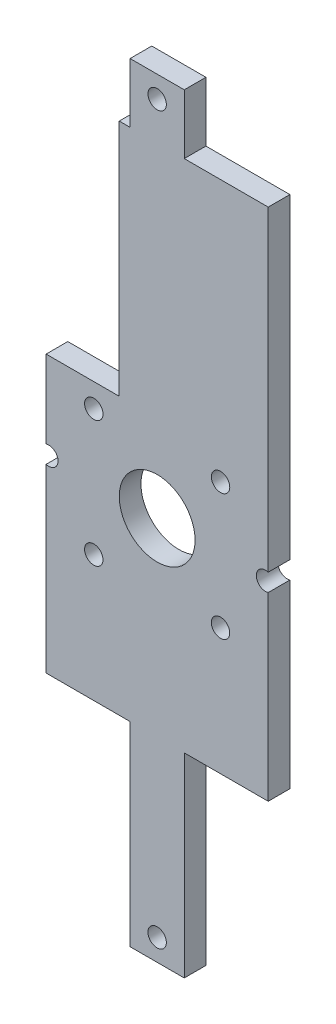
ISO-10303-21;
HEADER;
FILE_DESCRIPTION(('STEP AP214'),'2;1');
FILE_NAME('part.step','',(''),(''),'','','');
FILE_SCHEMA(('AUTOMOTIVE_DESIGN { 1 0 10303 214 1 1 1 1 }'));
ENDSEC;
DATA;
#1=APPLICATION_CONTEXT('core data for automotive mechanical design processes');
#2=APPLICATION_PROTOCOL_DEFINITION('international standard','automotive_design',2000,#1);
#3=PRODUCT_CONTEXT('',#1,'mechanical');
#4=PRODUCT('Part','Part','',(#3));
#5=PRODUCT_RELATED_PRODUCT_CATEGORY('part','',(#4));
#6=PRODUCT_DEFINITION_FORMATION('','',#4);
#7=PRODUCT_DEFINITION_CONTEXT('part definition',#1,'design');
#8=PRODUCT_DEFINITION('design','',#6,#7);
#9=PRODUCT_DEFINITION_SHAPE('','',#8);
#10=(LENGTH_UNIT() NAMED_UNIT(*) SI_UNIT(.MILLI.,.METRE.));
#11=(NAMED_UNIT(*) PLANE_ANGLE_UNIT() SI_UNIT($,.RADIAN.));
#12=(NAMED_UNIT(*) SI_UNIT($,.STERADIAN.) SOLID_ANGLE_UNIT());
#13=UNCERTAINTY_MEASURE_WITH_UNIT(LENGTH_MEASURE(1.E-05),#10,'distance_accuracy_value','');
#14=(GEOMETRIC_REPRESENTATION_CONTEXT(3) GLOBAL_UNCERTAINTY_ASSIGNED_CONTEXT((#13)) GLOBAL_UNIT_ASSIGNED_CONTEXT((#10,
#11,#12)) REPRESENTATION_CONTEXT('',''));
#15=CARTESIAN_POINT('',(0.,0.,0.));
#16=DIRECTION('',(0.,0.,1.));
#17=DIRECTION('',(1.,0.,0.));
#18=AXIS2_PLACEMENT_3D('',#15,#16,#17);
#19=CARTESIAN_POINT('',(-20.5,-35.,4.));
#20=DIRECTION('',(0.,0.,1.));
#21=DIRECTION('',(1.,0.,0.));
#22=AXIS2_PLACEMENT_3D('',#19,#20,#21);
#23=PLANE('',#22);
#24=CARTESIAN_POINT('',(11.7,11.65,4.));
#25=DIRECTION('',(0.,0.,1.));
#26=DIRECTION('',(1.,0.,0.));
#27=AXIS2_PLACEMENT_3D('',#24,#25,#26);
#28=CIRCLE('',#27,1.7);
#29=CARTESIAN_POINT('',(13.4,11.65,4.));
#30=VERTEX_POINT('',#29);
#31=EDGE_CURVE('E229',#30,#30,#28,.T.);
#32=ORIENTED_EDGE('',*,*,#31,.F.);
#33=EDGE_LOOP('',(#32));
#34=FACE_BOUND('',#33,.T.);
#35=CARTESIAN_POINT('',(0.,67.,4.));
#36=DIRECTION('',(0.,0.,1.));
#37=DIRECTION('',(1.,0.,0.));
#38=AXIS2_PLACEMENT_3D('',#35,#36,#37);
#39=CIRCLE('',#38,1.7);
#40=CARTESIAN_POINT('',(1.7,67.,4.));
#41=VERTEX_POINT('',#40);
#42=EDGE_CURVE('E206',#41,#41,#39,.T.);
#43=ORIENTED_EDGE('',*,*,#42,.F.);
#44=EDGE_LOOP('',(#43));
#45=FACE_BOUND('',#44,.T.);
#46=CARTESIAN_POINT('',(0.,0.,4.));
#47=DIRECTION('',(0.,0.,1.));
#48=DIRECTION('',(1.,0.,0.));
#49=AXIS2_PLACEMENT_3D('',#46,#47,#48);
#50=CIRCLE('',#49,7.);
#51=CARTESIAN_POINT('',(7.,0.,4.));
#52=VERTEX_POINT('',#51);
#53=EDGE_CURVE('E201',#52,#52,#50,.T.);
#54=ORIENTED_EDGE('',*,*,#53,.F.);
#55=EDGE_LOOP('',(#54));
#56=FACE_BOUND('',#55,.T.);
#57=CARTESIAN_POINT('',(-11.7,11.65,4.));
#58=DIRECTION('',(0.,0.,1.));
#59=DIRECTION('',(1.,0.,0.));
#60=AXIS2_PLACEMENT_3D('',#57,#58,#59);
#61=CIRCLE('',#60,1.7);
#62=CARTESIAN_POINT('',(-10.,11.65,4.));
#63=VERTEX_POINT('',#62);
#64=EDGE_CURVE('E205',#63,#63,#61,.T.);
#65=ORIENTED_EDGE('',*,*,#64,.F.);
#66=EDGE_LOOP('',(#65));
#67=FACE_BOUND('',#66,.T.);
#68=CARTESIAN_POINT('',(11.7,-11.65,4.));
#69=DIRECTION('',(0.,0.,1.));
#70=DIRECTION('',(1.,0.,0.));
#71=AXIS2_PLACEMENT_3D('',#68,#69,#70);
#72=CIRCLE('',#71,1.7);
#73=CARTESIAN_POINT('',(13.4,-11.65,4.));
#74=VERTEX_POINT('',#73);
#75=EDGE_CURVE('E210',#74,#74,#72,.T.);
#76=ORIENTED_EDGE('',*,*,#75,.F.);
#77=EDGE_LOOP('',(#76));
#78=FACE_BOUND('',#77,.T.);
#79=CARTESIAN_POINT('',(-11.7,-11.65,4.));
#80=DIRECTION('',(0.,0.,1.));
#81=DIRECTION('',(1.,0.,0.));
#82=AXIS2_PLACEMENT_3D('',#79,#80,#81);
#83=CIRCLE('',#82,1.7);
#84=CARTESIAN_POINT('',(-10.,-11.65,4.));
#85=VERTEX_POINT('',#84);
#86=EDGE_CURVE('E207',#85,#85,#83,.T.);
#87=ORIENTED_EDGE('',*,*,#86,.F.);
#88=EDGE_LOOP('',(#87));
#89=FACE_BOUND('',#88,.T.);
#90=CARTESIAN_POINT('',(0.,-67.,4.));
#91=DIRECTION('',(0.,0.,1.));
#92=DIRECTION('',(1.,0.,0.));
#93=AXIS2_PLACEMENT_3D('',#90,#91,#92);
#94=CIRCLE('',#93,1.7);
#95=CARTESIAN_POINT('',(1.7,-67.,4.));
#96=VERTEX_POINT('',#95);
#97=EDGE_CURVE('E26',#96,#96,#94,.T.);
#98=ORIENTED_EDGE('',*,*,#97,.F.);
#99=EDGE_LOOP('',(#98));
#100=FACE_BOUND('',#99,.T.);
#101=DIRECTION('',(0.,1.,0.));
#102=VECTOR('',#101,1.);
#103=CARTESIAN_POINT('',(-20.5,-35.,4.));
#104=LINE('',#103,#102);
#105=CARTESIAN_POINT('',(-20.5,-35.,4.));
#106=VERTEX_POINT('',#105);
#107=CARTESIAN_POINT('',(-20.5,-1.624807680927,4.));
#108=VERTEX_POINT('',#107);
#109=EDGE_CURVE('E384',#106,#108,#104,.T.);
#110=ORIENTED_EDGE('',*,*,#109,.F.);
#111=DIRECTION('',(1.,0.,0.));
#112=VECTOR('',#111,1.);
#113=CARTESIAN_POINT('',(-20.5,-35.,4.));
#114=LINE('',#113,#112);
#115=CARTESIAN_POINT('',(-5.,-35.,4.));
#116=VERTEX_POINT('',#115);
#117=EDGE_CURVE('E401',#106,#116,#114,.T.);
#118=ORIENTED_EDGE('',*,*,#117,.T.);
#119=DIRECTION('',(0.,1.,0.));
#120=VECTOR('',#119,1.);
#121=CARTESIAN_POINT('',(-5.,-71.,4.));
#122=LINE('',#121,#120);
#123=CARTESIAN_POINT('',(-5.,-71.,4.));
#124=VERTEX_POINT('',#123);
#125=EDGE_CURVE('E400',#124,#116,#122,.T.);
#126=ORIENTED_EDGE('',*,*,#125,.F.);
#127=DIRECTION('',(1.,0.,0.));
#128=VECTOR('',#127,1.);
#129=CARTESIAN_POINT('',(-5.,-71.,4.));
#130=LINE('',#129,#128);
#131=CARTESIAN_POINT('',(5.,-71.,4.));
#132=VERTEX_POINT('',#131);
#133=EDGE_CURVE('E393',#124,#132,#130,.T.);
#134=ORIENTED_EDGE('',*,*,#133,.T.);
#135=DIRECTION('',(0.,1.,0.));
#136=VECTOR('',#135,1.);
#137=CARTESIAN_POINT('',(5.,-71.,4.));
#138=LINE('',#137,#136);
#139=CARTESIAN_POINT('',(5.,-35.,4.));
#140=VERTEX_POINT('',#139);
#141=EDGE_CURVE('E435',#132,#140,#138,.T.);
#142=ORIENTED_EDGE('',*,*,#141,.T.);
#143=DIRECTION('',(1.,0.,0.));
#144=VECTOR('',#143,1.);
#145=CARTESIAN_POINT('',(-20.5,-35.,4.));
#146=LINE('',#145,#144);
#147=CARTESIAN_POINT('',(20.5,-35.,4.));
#148=VERTEX_POINT('',#147);
#149=EDGE_CURVE('E445',#140,#148,#146,.T.);
#150=ORIENTED_EDGE('',*,*,#149,.T.);
#151=DIRECTION('',(0.,1.,0.));
#152=VECTOR('',#151,1.);
#153=CARTESIAN_POINT('',(20.5,-35.,4.));
#154=LINE('',#153,#152);
#155=CARTESIAN_POINT('',(20.5,-1.624807680927,4.));
#156=VERTEX_POINT('',#155);
#157=EDGE_CURVE('E261',#148,#156,#154,.T.);
#158=ORIENTED_EDGE('',*,*,#157,.T.);
#159=CARTESIAN_POINT('',(20.,0.,4.));
#160=DIRECTION('',(0.,0.,1.));
#161=DIRECTION('',(1.,0.,0.));
#162=AXIS2_PLACEMENT_3D('',#159,#160,#161);
#163=CIRCLE('',#162,1.7);
#164=CARTESIAN_POINT('',(20.5,1.624807680927,4.));
#165=VERTEX_POINT('',#164);
#166=EDGE_CURVE('E278',#165,#156,#163,.T.);
#167=ORIENTED_EDGE('',*,*,#166,.F.);
#168=DIRECTION('',(0.,1.,0.));
#169=VECTOR('',#168,1.);
#170=CARTESIAN_POINT('',(20.5,-35.,4.));
#171=LINE('',#170,#169);
#172=CARTESIAN_POINT('',(20.5,60.,4.));
#173=VERTEX_POINT('',#172);
#174=EDGE_CURVE('E285',#165,#173,#171,.T.);
#175=ORIENTED_EDGE('',*,*,#174,.T.);
#176=DIRECTION('',(1.,0.,0.));
#177=VECTOR('',#176,1.);
#178=CARTESIAN_POINT('',(-20.5,60.,4.));
#179=LINE('',#178,#177);
#180=CARTESIAN_POINT('',(5.,60.,4.));
#181=VERTEX_POINT('',#180);
#182=EDGE_CURVE('E298',#181,#173,#179,.T.);
#183=ORIENTED_EDGE('',*,*,#182,.F.);
#184=DIRECTION('',(0.,1.,0.));
#185=VECTOR('',#184,1.);
#186=CARTESIAN_POINT('',(5.,60.,4.));
#187=LINE('',#186,#185);
#188=CARTESIAN_POINT('',(5.,71.,4.));
#189=VERTEX_POINT('',#188);
#190=EDGE_CURVE('E311',#181,#189,#187,.T.);
#191=ORIENTED_EDGE('',*,*,#190,.T.);
#192=DIRECTION('',(1.,0.,0.));
#193=VECTOR('',#192,1.);
#194=CARTESIAN_POINT('',(-5.,71.,4.));
#195=LINE('',#194,#193);
#196=CARTESIAN_POINT('',(-5.,71.,4.));
#197=VERTEX_POINT('',#196);
#198=EDGE_CURVE('E322',#197,#189,#195,.T.);
#199=ORIENTED_EDGE('',*,*,#198,.F.);
#200=DIRECTION('',(0.,1.,0.));
#201=VECTOR('',#200,1.);
#202=CARTESIAN_POINT('',(-5.,60.,4.));
#203=LINE('',#202,#201);
#204=CARTESIAN_POINT('',(-5.,60.,4.));
#205=VERTEX_POINT('',#204);
#206=EDGE_CURVE('E325',#205,#197,#203,.T.);
#207=ORIENTED_EDGE('',*,*,#206,.F.);
#208=DIRECTION('',(1.,0.,0.));
#209=VECTOR('',#208,1.);
#210=CARTESIAN_POINT('',(-20.5,60.,4.));
#211=LINE('',#210,#209);
#212=CARTESIAN_POINT('',(-7.,60.,4.));
#213=VERTEX_POINT('',#212);
#214=EDGE_CURVE('E340',#213,#205,#211,.T.);
#215=ORIENTED_EDGE('',*,*,#214,.F.);
#216=DIRECTION('',(0.,1.,0.));
#217=VECTOR('',#216,1.);
#218=CARTESIAN_POINT('',(-7.,-9.5,4.));
#219=LINE('',#218,#217);
#220=CARTESIAN_POINT('',(-7.,16.,4.));
#221=VERTEX_POINT('',#220);
#222=EDGE_CURVE('E158',#221,#213,#219,.T.);
#223=ORIENTED_EDGE('',*,*,#222,.F.);
#224=DIRECTION('',(-1.,0.,0.));
#225=VECTOR('',#224,1.);
#226=CARTESIAN_POINT('',(-21.,16.,4.));
#227=LINE('',#226,#225);
#228=CARTESIAN_POINT('',(-20.5,16.,4.));
#229=VERTEX_POINT('',#228);
#230=EDGE_CURVE('E155',#221,#229,#227,.T.);
#231=ORIENTED_EDGE('',*,*,#230,.T.);
#232=DIRECTION('',(0.,1.,0.));
#233=VECTOR('',#232,1.);
#234=CARTESIAN_POINT('',(-20.5,-35.,4.));
#235=LINE('',#234,#233);
#236=CARTESIAN_POINT('',(-20.5,1.624807680927,4.));
#237=VERTEX_POINT('',#236);
#238=EDGE_CURVE('E142',#237,#229,#235,.T.);
#239=ORIENTED_EDGE('',*,*,#238,.F.);
#240=CARTESIAN_POINT('',(-20.,0.,4.));
#241=DIRECTION('',(0.,0.,-1.));
#242=DIRECTION('',(-0.294117647058934,0.955769224074785,0.));
#243=AXIS2_PLACEMENT_3D('',#240,#241,#242);
#244=CIRCLE('',#243,1.7);
#245=EDGE_CURVE('E11',#237,#108,#244,.T.);
#246=ORIENTED_EDGE('',*,*,#245,.T.);
#247=EDGE_LOOP('',(#110,#118,#126,#134,#142,#150,#158,#167,#175,#183,#191,#199,#207,#215,#223,
#231,#239,#246));
#248=FACE_BOUND('',#247,.T.);
#249=ADVANCED_FACE('F17',(#34,#45,#56,#67,#78,#89,#100,#248),#23,.T.);
#250=CARTESIAN_POINT('',(-20.,0.,-6.));
#251=DIRECTION('',(0.,0.,1.));
#252=DIRECTION('',(1.,0.,0.));
#253=AXIS2_PLACEMENT_3D('',#250,#251,#252);
#254=CYLINDRICAL_SURFACE('',#253,1.7);
#255=DIRECTION('',(0.,0.,1.));
#256=VECTOR('',#255,1.);
#257=CARTESIAN_POINT('',(-20.5,-1.624807680927,-6.));
#258=LINE('',#257,#256);
#259=CARTESIAN_POINT('',(-20.5,-1.624807680927,0.));
#260=VERTEX_POINT('',#259);
#261=EDGE_CURVE('E363',#260,#108,#258,.T.);
#262=ORIENTED_EDGE('',*,*,#261,.T.);
#263=ORIENTED_EDGE('',*,*,#245,.F.);
#264=DIRECTION('',(0.,0.,1.));
#265=VECTOR('',#264,1.);
#266=CARTESIAN_POINT('',(-20.5,1.624807680927,-6.));
#267=LINE('',#266,#265);
#268=CARTESIAN_POINT('',(-20.5,1.624807680927,0.));
#269=VERTEX_POINT('',#268);
#270=EDGE_CURVE('E149',#269,#237,#267,.T.);
#271=ORIENTED_EDGE('',*,*,#270,.F.);
#272=CARTESIAN_POINT('',(-20.,0.,0.));
#273=DIRECTION('',(0.,0.,-1.));
#274=DIRECTION('',(-0.294117647058934,0.955769224074785,0.));
#275=AXIS2_PLACEMENT_3D('',#272,#273,#274);
#276=CIRCLE('',#275,1.7);
#277=EDGE_CURVE('E152',#269,#260,#276,.T.);
#278=ORIENTED_EDGE('',*,*,#277,.T.);
#279=EDGE_LOOP('',(#262,#263,#271,#278));
#280=FACE_BOUND('',#279,.T.);
#281=ADVANCED_FACE('F220',(#280),#254,.F.);
#282=CARTESIAN_POINT('',(0.,-67.,-6.));
#283=DIRECTION('',(0.,0.,1.));
#284=DIRECTION('',(1.,0.,0.));
#285=AXIS2_PLACEMENT_3D('',#282,#283,#284);
#286=CYLINDRICAL_SURFACE('',#285,1.7);
#287=ORIENTED_EDGE('',*,*,#97,.T.);
#288=EDGE_LOOP('',(#287));
#289=FACE_BOUND('',#288,.T.);
#290=CARTESIAN_POINT('',(0.,-67.,0.));
#291=DIRECTION('',(0.,0.,1.));
#292=DIRECTION('',(1.,0.,0.));
#293=AXIS2_PLACEMENT_3D('',#290,#291,#292);
#294=CIRCLE('',#293,1.7);
#295=CARTESIAN_POINT('',(1.7,-67.,0.));
#296=VERTEX_POINT('',#295);
#297=EDGE_CURVE('E182',#296,#296,#294,.T.);
#298=ORIENTED_EDGE('',*,*,#297,.F.);
#299=EDGE_LOOP('',(#298));
#300=FACE_BOUND('',#299,.T.);
#301=ADVANCED_FACE('F216',(#289,#300),#286,.F.);
#302=CARTESIAN_POINT('',(-11.7,-11.65,-6.));
#303=DIRECTION('',(0.,0.,1.));
#304=DIRECTION('',(1.,0.,0.));
#305=AXIS2_PLACEMENT_3D('',#302,#303,#304);
#306=CYLINDRICAL_SURFACE('',#305,1.7);
#307=ORIENTED_EDGE('',*,*,#86,.T.);
#308=EDGE_LOOP('',(#307));
#309=FACE_BOUND('',#308,.T.);
#310=CARTESIAN_POINT('',(-11.7,-11.65,0.));
#311=DIRECTION('',(0.,0.,1.));
#312=DIRECTION('',(1.,0.,0.));
#313=AXIS2_PLACEMENT_3D('',#310,#311,#312);
#314=CIRCLE('',#313,1.7);
#315=CARTESIAN_POINT('',(-10.,-11.65,0.));
#316=VERTEX_POINT('',#315);
#317=EDGE_CURVE('E186',#316,#316,#314,.T.);
#318=ORIENTED_EDGE('',*,*,#317,.F.);
#319=EDGE_LOOP('',(#318));
#320=FACE_BOUND('',#319,.T.);
#321=ADVANCED_FACE('F243',(#309,#320),#306,.F.);
#322=CARTESIAN_POINT('',(11.7,-11.65,-6.));
#323=DIRECTION('',(0.,0.,1.));
#324=DIRECTION('',(1.,0.,0.));
#325=AXIS2_PLACEMENT_3D('',#322,#323,#324);
#326=CYLINDRICAL_SURFACE('',#325,1.7);
#327=ORIENTED_EDGE('',*,*,#75,.T.);
#328=EDGE_LOOP('',(#327));
#329=FACE_BOUND('',#328,.T.);
#330=CARTESIAN_POINT('',(11.7,-11.65,0.));
#331=DIRECTION('',(0.,0.,1.));
#332=DIRECTION('',(1.,0.,0.));
#333=AXIS2_PLACEMENT_3D('',#330,#331,#332);
#334=CIRCLE('',#333,1.7);
#335=CARTESIAN_POINT('',(13.4,-11.65,0.));
#336=VERTEX_POINT('',#335);
#337=EDGE_CURVE('E192',#336,#336,#334,.T.);
#338=ORIENTED_EDGE('',*,*,#337,.F.);
#339=EDGE_LOOP('',(#338));
#340=FACE_BOUND('',#339,.T.);
#341=ADVANCED_FACE('F246',(#329,#340),#326,.F.);
#342=CARTESIAN_POINT('',(-11.7,11.65,-6.));
#343=DIRECTION('',(0.,0.,1.));
#344=DIRECTION('',(1.,0.,0.));
#345=AXIS2_PLACEMENT_3D('',#342,#343,#344);
#346=CYLINDRICAL_SURFACE('',#345,1.7);
#347=ORIENTED_EDGE('',*,*,#64,.T.);
#348=EDGE_LOOP('',(#347));
#349=FACE_BOUND('',#348,.T.);
#350=CARTESIAN_POINT('',(-11.7,11.65,0.));
#351=DIRECTION('',(0.,0.,1.));
#352=DIRECTION('',(1.,0.,0.));
#353=AXIS2_PLACEMENT_3D('',#350,#351,#352);
#354=CIRCLE('',#353,1.7);
#355=CARTESIAN_POINT('',(-10.,11.65,0.));
#356=VERTEX_POINT('',#355);
#357=EDGE_CURVE('E187',#356,#356,#354,.T.);
#358=ORIENTED_EDGE('',*,*,#357,.F.);
#359=EDGE_LOOP('',(#358));
#360=FACE_BOUND('',#359,.T.);
#361=ADVANCED_FACE('F534',(#349,#360),#346,.F.);
#362=CARTESIAN_POINT('',(0.,0.,-6.));
#363=DIRECTION('',(0.,0.,1.));
#364=DIRECTION('',(1.,0.,0.));
#365=AXIS2_PLACEMENT_3D('',#362,#363,#364);
#366=CYLINDRICAL_SURFACE('',#365,7.);
#367=ORIENTED_EDGE('',*,*,#53,.T.);
#368=EDGE_LOOP('',(#367));
#369=FACE_BOUND('',#368,.T.);
#370=CARTESIAN_POINT('',(0.,0.,0.));
#371=DIRECTION('',(0.,0.,1.));
#372=DIRECTION('',(1.,0.,0.));
#373=AXIS2_PLACEMENT_3D('',#370,#371,#372);
#374=CIRCLE('',#373,7.);
#375=CARTESIAN_POINT('',(7.,0.,0.));
#376=VERTEX_POINT('',#375);
#377=EDGE_CURVE('E191',#376,#376,#374,.T.);
#378=ORIENTED_EDGE('',*,*,#377,.F.);
#379=EDGE_LOOP('',(#378));
#380=FACE_BOUND('',#379,.T.);
#381=ADVANCED_FACE('F537',(#369,#380),#366,.F.);
#382=CARTESIAN_POINT('',(0.,67.,-6.));
#383=DIRECTION('',(0.,0.,1.));
#384=DIRECTION('',(1.,0.,0.));
#385=AXIS2_PLACEMENT_3D('',#382,#383,#384);
#386=CYLINDRICAL_SURFACE('',#385,1.7);
#387=ORIENTED_EDGE('',*,*,#42,.T.);
#388=EDGE_LOOP('',(#387));
#389=FACE_BOUND('',#388,.T.);
#390=CARTESIAN_POINT('',(0.,67.,0.));
#391=DIRECTION('',(0.,0.,1.));
#392=DIRECTION('',(1.,0.,0.));
#393=AXIS2_PLACEMENT_3D('',#390,#391,#392);
#394=CIRCLE('',#393,1.7);
#395=CARTESIAN_POINT('',(1.7,67.,0.));
#396=VERTEX_POINT('',#395);
#397=EDGE_CURVE('E196',#396,#396,#394,.T.);
#398=ORIENTED_EDGE('',*,*,#397,.F.);
#399=EDGE_LOOP('',(#398));
#400=FACE_BOUND('',#399,.T.);
#401=ADVANCED_FACE('F559',(#389,#400),#386,.F.);
#402=CARTESIAN_POINT('',(11.7,11.65,-6.));
#403=DIRECTION('',(0.,0.,1.));
#404=DIRECTION('',(1.,0.,0.));
#405=AXIS2_PLACEMENT_3D('',#402,#403,#404);
#406=CYLINDRICAL_SURFACE('',#405,1.7);
#407=ORIENTED_EDGE('',*,*,#31,.T.);
#408=EDGE_LOOP('',(#407));
#409=FACE_BOUND('',#408,.T.);
#410=CARTESIAN_POINT('',(11.7,11.65,0.));
#411=DIRECTION('',(0.,0.,1.));
#412=DIRECTION('',(1.,0.,0.));
#413=AXIS2_PLACEMENT_3D('',#410,#411,#412);
#414=CIRCLE('',#413,1.7);
#415=CARTESIAN_POINT('',(13.4,11.65,0.));
#416=VERTEX_POINT('',#415);
#417=EDGE_CURVE('E200',#416,#416,#414,.T.);
#418=ORIENTED_EDGE('',*,*,#417,.F.);
#419=EDGE_LOOP('',(#418));
#420=FACE_BOUND('',#419,.T.);
#421=ADVANCED_FACE('F556',(#409,#420),#406,.F.);
#422=CARTESIAN_POINT('',(-20.5,-35.,0.));
#423=DIRECTION('',(0.,0.,1.));
#424=DIRECTION('',(1.,0.,0.));
#425=AXIS2_PLACEMENT_3D('',#422,#423,#424);
#426=PLANE('',#425);
#427=ORIENTED_EDGE('',*,*,#417,.T.);
#428=EDGE_LOOP('',(#427));
#429=FACE_BOUND('',#428,.T.);
#430=ORIENTED_EDGE('',*,*,#397,.T.);
#431=EDGE_LOOP('',(#430));
#432=FACE_BOUND('',#431,.T.);
#433=ORIENTED_EDGE('',*,*,#377,.T.);
#434=EDGE_LOOP('',(#433));
#435=FACE_BOUND('',#434,.T.);
#436=ORIENTED_EDGE('',*,*,#357,.T.);
#437=EDGE_LOOP('',(#436));
#438=FACE_BOUND('',#437,.T.);
#439=ORIENTED_EDGE('',*,*,#337,.T.);
#440=EDGE_LOOP('',(#439));
#441=FACE_BOUND('',#440,.T.);
#442=ORIENTED_EDGE('',*,*,#317,.T.);
#443=EDGE_LOOP('',(#442));
#444=FACE_BOUND('',#443,.T.);
#445=ORIENTED_EDGE('',*,*,#297,.T.);
#446=EDGE_LOOP('',(#445));
#447=FACE_BOUND('',#446,.T.);
#448=ORIENTED_EDGE('',*,*,#277,.F.);
#449=DIRECTION('',(0.,1.,0.));
#450=VECTOR('',#449,1.);
#451=CARTESIAN_POINT('',(-20.5,-35.,0.));
#452=LINE('',#451,#450);
#453=CARTESIAN_POINT('',(-20.5,16.,0.));
#454=VERTEX_POINT('',#453);
#455=EDGE_CURVE('E163',#269,#454,#452,.T.);
#456=ORIENTED_EDGE('',*,*,#455,.T.);
#457=DIRECTION('',(-1.,0.,0.));
#458=VECTOR('',#457,1.);
#459=CARTESIAN_POINT('',(-21.,16.,0.));
#460=LINE('',#459,#458);
#461=CARTESIAN_POINT('',(-7.,16.,0.));
#462=VERTEX_POINT('',#461);
#463=EDGE_CURVE('E166',#462,#454,#460,.T.);
#464=ORIENTED_EDGE('',*,*,#463,.F.);
#465=DIRECTION('',(0.,1.,0.));
#466=VECTOR('',#465,1.);
#467=CARTESIAN_POINT('',(-7.,-9.5,0.));
#468=LINE('',#467,#466);
#469=CARTESIAN_POINT('',(-7.,60.,0.));
#470=VERTEX_POINT('',#469);
#471=EDGE_CURVE('E344',#462,#470,#468,.T.);
#472=ORIENTED_EDGE('',*,*,#471,.T.);
#473=DIRECTION('',(1.,0.,0.));
#474=VECTOR('',#473,1.);
#475=CARTESIAN_POINT('',(-20.5,60.,0.));
#476=LINE('',#475,#474);
#477=CARTESIAN_POINT('',(-5.,60.,0.));
#478=VERTEX_POINT('',#477);
#479=EDGE_CURVE('E333',#470,#478,#476,.T.);
#480=ORIENTED_EDGE('',*,*,#479,.T.);
#481=DIRECTION('',(0.,1.,0.));
#482=VECTOR('',#481,1.);
#483=CARTESIAN_POINT('',(-5.,60.,0.));
#484=LINE('',#483,#482);
#485=CARTESIAN_POINT('',(-5.,71.,0.));
#486=VERTEX_POINT('',#485);
#487=EDGE_CURVE('E326',#478,#486,#484,.T.);
#488=ORIENTED_EDGE('',*,*,#487,.T.);
#489=DIRECTION('',(1.,0.,0.));
#490=VECTOR('',#489,1.);
#491=CARTESIAN_POINT('',(-5.,71.,0.));
#492=LINE('',#491,#490);
#493=CARTESIAN_POINT('',(5.,71.,0.));
#494=VERTEX_POINT('',#493);
#495=EDGE_CURVE('E315',#486,#494,#492,.T.);
#496=ORIENTED_EDGE('',*,*,#495,.T.);
#497=DIRECTION('',(0.,1.,0.));
#498=VECTOR('',#497,1.);
#499=CARTESIAN_POINT('',(5.,60.,0.));
#500=LINE('',#499,#498);
#501=CARTESIAN_POINT('',(5.,60.,0.));
#502=VERTEX_POINT('',#501);
#503=EDGE_CURVE('E303',#502,#494,#500,.T.);
#504=ORIENTED_EDGE('',*,*,#503,.F.);
#505=DIRECTION('',(1.,0.,0.));
#506=VECTOR('',#505,1.);
#507=CARTESIAN_POINT('',(-20.5,60.,0.));
#508=LINE('',#507,#506);
#509=CARTESIAN_POINT('',(20.5,60.,0.));
#510=VERTEX_POINT('',#509);
#511=EDGE_CURVE('E283',#502,#510,#508,.T.);
#512=ORIENTED_EDGE('',*,*,#511,.T.);
#513=DIRECTION('',(0.,1.,0.));
#514=VECTOR('',#513,1.);
#515=CARTESIAN_POINT('',(20.5,-35.,0.));
#516=LINE('',#515,#514);
#517=CARTESIAN_POINT('',(20.5,1.624807680927,0.));
#518=VERTEX_POINT('',#517);
#519=EDGE_CURVE('E284',#518,#510,#516,.T.);
#520=ORIENTED_EDGE('',*,*,#519,.F.);
#521=CARTESIAN_POINT('',(20.,0.,0.));
#522=DIRECTION('',(0.,0.,1.));
#523=DIRECTION('',(1.,0.,0.));
#524=AXIS2_PLACEMENT_3D('',#521,#522,#523);
#525=CIRCLE('',#524,1.7);
#526=CARTESIAN_POINT('',(20.5,-1.624807680927,0.));
#527=VERTEX_POINT('',#526);
#528=EDGE_CURVE('E270',#518,#527,#525,.T.);
#529=ORIENTED_EDGE('',*,*,#528,.T.);
#530=DIRECTION('',(0.,1.,0.));
#531=VECTOR('',#530,1.);
#532=CARTESIAN_POINT('',(20.5,-35.,0.));
#533=LINE('',#532,#531);
#534=CARTESIAN_POINT('',(20.5,-35.,0.));
#535=VERTEX_POINT('',#534);
#536=EDGE_CURVE('E263',#535,#527,#533,.T.);
#537=ORIENTED_EDGE('',*,*,#536,.F.);
#538=DIRECTION('',(1.,0.,0.));
#539=VECTOR('',#538,1.);
#540=CARTESIAN_POINT('',(-20.5,-35.,0.));
#541=LINE('',#540,#539);
#542=CARTESIAN_POINT('',(5.,-35.,0.));
#543=VERTEX_POINT('',#542);
#544=EDGE_CURVE('E449',#543,#535,#541,.T.);
#545=ORIENTED_EDGE('',*,*,#544,.F.);
#546=DIRECTION('',(0.,1.,0.));
#547=VECTOR('',#546,1.);
#548=CARTESIAN_POINT('',(5.,-71.,0.));
#549=LINE('',#548,#547);
#550=CARTESIAN_POINT('',(5.,-71.,0.));
#551=VERTEX_POINT('',#550);
#552=EDGE_CURVE('E392',#551,#543,#549,.T.);
#553=ORIENTED_EDGE('',*,*,#552,.F.);
#554=DIRECTION('',(1.,0.,0.));
#555=VECTOR('',#554,1.);
#556=CARTESIAN_POINT('',(-5.,-71.,0.));
#557=LINE('',#556,#555);
#558=CARTESIAN_POINT('',(-5.,-71.,0.));
#559=VERTEX_POINT('',#558);
#560=EDGE_CURVE('E388',#559,#551,#557,.T.);
#561=ORIENTED_EDGE('',*,*,#560,.F.);
#562=DIRECTION('',(0.,1.,0.));
#563=VECTOR('',#562,1.);
#564=CARTESIAN_POINT('',(-5.,-71.,0.));
#565=LINE('',#564,#563);
#566=CARTESIAN_POINT('',(-5.,-35.,0.));
#567=VERTEX_POINT('',#566);
#568=EDGE_CURVE('E411',#559,#567,#565,.T.);
#569=ORIENTED_EDGE('',*,*,#568,.T.);
#570=DIRECTION('',(1.,0.,0.));
#571=VECTOR('',#570,1.);
#572=CARTESIAN_POINT('',(-20.5,-35.,0.));
#573=LINE('',#572,#571);
#574=CARTESIAN_POINT('',(-20.5,-35.,0.));
#575=VERTEX_POINT('',#574);
#576=EDGE_CURVE('E396',#575,#567,#573,.T.);
#577=ORIENTED_EDGE('',*,*,#576,.F.);
#578=DIRECTION('',(0.,1.,0.));
#579=VECTOR('',#578,1.);
#580=CARTESIAN_POINT('',(-20.5,-35.,0.));
#581=LINE('',#580,#579);
#582=EDGE_CURVE('E360',#575,#260,#581,.T.);
#583=ORIENTED_EDGE('',*,*,#582,.T.);
#584=EDGE_LOOP('',(#448,#456,#464,#472,#480,#488,#496,#504,#512,#520,#529,#537,#545,#553,#561,
#569,#577,#583));
#585=FACE_BOUND('',#584,.T.);
#586=ADVANCED_FACE('F354',(#429,#432,#435,#438,#441,#444,#447,#585),#426,.F.);
#587=CARTESIAN_POINT('',(-20.5,-35.,0.));
#588=DIRECTION('',(1.,0.,0.));
#589=DIRECTION('',(0.,1.,0.));
#590=AXIS2_PLACEMENT_3D('',#587,#588,#589);
#591=PLANE('',#590);
#592=DIRECTION('',(0.,0.,1.));
#593=VECTOR('',#592,1.);
#594=CARTESIAN_POINT('',(-20.5,16.,-3.));
#595=LINE('',#594,#593);
#596=EDGE_CURVE('E147',#454,#229,#595,.T.);
#597=ORIENTED_EDGE('',*,*,#596,.F.);
#598=ORIENTED_EDGE('',*,*,#455,.F.);
#599=ORIENTED_EDGE('',*,*,#270,.T.);
#600=ORIENTED_EDGE('',*,*,#238,.T.);
#601=EDGE_LOOP('',(#597,#598,#599,#600));
#602=FACE_BOUND('',#601,.T.);
#603=ADVANCED_FACE('F144',(#602),#591,.F.);
#604=CARTESIAN_POINT('',(-21.5,16.,-6.));
#605=DIRECTION('',(0.,1.,0.));
#606=DIRECTION('',(1.,0.,0.));
#607=AXIS2_PLACEMENT_3D('',#604,#605,#606);
#608=PLANE('',#607);
#609=DIRECTION('',(0.,0.,1.));
#610=VECTOR('',#609,1.);
#611=CARTESIAN_POINT('',(-7.,16.,-6.));
#612=LINE('',#611,#610);
#613=EDGE_CURVE('E172',#462,#221,#612,.T.);
#614=ORIENTED_EDGE('',*,*,#613,.F.);
#615=ORIENTED_EDGE('',*,*,#463,.T.);
#616=ORIENTED_EDGE('',*,*,#596,.T.);
#617=ORIENTED_EDGE('',*,*,#230,.F.);
#618=EDGE_LOOP('',(#614,#615,#616,#617));
#619=FACE_BOUND('',#618,.T.);
#620=ADVANCED_FACE('F165',(#619),#608,.T.);
#621=CARTESIAN_POINT('',(-7.,16.,-6.));
#622=DIRECTION('',(1.,0.,0.));
#623=DIRECTION('',(0.,1.,0.));
#624=AXIS2_PLACEMENT_3D('',#621,#622,#623);
#625=PLANE('',#624);
#626=ORIENTED_EDGE('',*,*,#222,.T.);
#627=DIRECTION('',(0.,0.,-1.));
#628=VECTOR('',#627,1.);
#629=CARTESIAN_POINT('',(-7.,60.,-3.));
#630=LINE('',#629,#628);
#631=EDGE_CURVE('E336',#213,#470,#630,.T.);
#632=ORIENTED_EDGE('',*,*,#631,.T.);
#633=ORIENTED_EDGE('',*,*,#471,.F.);
#634=ORIENTED_EDGE('',*,*,#613,.T.);
#635=EDGE_LOOP('',(#626,#632,#633,#634));
#636=FACE_BOUND('',#635,.T.);
#637=ADVANCED_FACE('F350',(#636),#625,.F.);
#638=CARTESIAN_POINT('',(-20.5,60.,0.));
#639=DIRECTION('',(0.,1.,0.));
#640=DIRECTION('',(1.,0.,0.));
#641=AXIS2_PLACEMENT_3D('',#638,#639,#640);
#642=PLANE('',#641);
#643=ORIENTED_EDGE('',*,*,#479,.F.);
#644=ORIENTED_EDGE('',*,*,#631,.F.);
#645=ORIENTED_EDGE('',*,*,#214,.T.);
#646=DIRECTION('',(0.,0.,1.));
#647=VECTOR('',#646,1.);
#648=CARTESIAN_POINT('',(-5.,60.,0.));
#649=LINE('',#648,#647);
#650=EDGE_CURVE('E329',#478,#205,#649,.T.);
#651=ORIENTED_EDGE('',*,*,#650,.F.);
#652=EDGE_LOOP('',(#643,#644,#645,#651));
#653=FACE_BOUND('',#652,.T.);
#654=ADVANCED_FACE('F532',(#653),#642,.T.);
#655=CARTESIAN_POINT('',(-5.,60.,0.));
#656=DIRECTION('',(1.,0.,0.));
#657=DIRECTION('',(0.,1.,0.));
#658=AXIS2_PLACEMENT_3D('',#655,#656,#657);
#659=PLANE('',#658);
#660=ORIENTED_EDGE('',*,*,#206,.T.);
#661=DIRECTION('',(0.,0.,1.));
#662=VECTOR('',#661,1.);
#663=CARTESIAN_POINT('',(-5.,71.,0.));
#664=LINE('',#663,#662);
#665=EDGE_CURVE('E318',#486,#197,#664,.T.);
#666=ORIENTED_EDGE('',*,*,#665,.F.);
#667=ORIENTED_EDGE('',*,*,#487,.F.);
#668=ORIENTED_EDGE('',*,*,#650,.T.);
#669=EDGE_LOOP('',(#660,#666,#667,#668));
#670=FACE_BOUND('',#669,.T.);
#671=ADVANCED_FACE('F528',(#670),#659,.F.);
#672=CARTESIAN_POINT('',(-5.,71.,0.));
#673=DIRECTION('',(0.,1.,0.));
#674=DIRECTION('',(1.,0.,0.));
#675=AXIS2_PLACEMENT_3D('',#672,#673,#674);
#676=PLANE('',#675);
#677=ORIENTED_EDGE('',*,*,#495,.F.);
#678=ORIENTED_EDGE('',*,*,#665,.T.);
#679=ORIENTED_EDGE('',*,*,#198,.T.);
#680=DIRECTION('',(0.,0.,1.));
#681=VECTOR('',#680,1.);
#682=CARTESIAN_POINT('',(5.,71.,0.));
#683=LINE('',#682,#681);
#684=EDGE_CURVE('E307',#494,#189,#683,.T.);
#685=ORIENTED_EDGE('',*,*,#684,.F.);
#686=EDGE_LOOP('',(#677,#678,#679,#685));
#687=FACE_BOUND('',#686,.T.);
#688=ADVANCED_FACE('F524',(#687),#676,.T.);
#689=CARTESIAN_POINT('',(5.,60.,0.));
#690=DIRECTION('',(1.,0.,0.));
#691=DIRECTION('',(0.,1.,0.));
#692=AXIS2_PLACEMENT_3D('',#689,#690,#691);
#693=PLANE('',#692);
#694=DIRECTION('',(0.,0.,1.));
#695=VECTOR('',#694,1.);
#696=CARTESIAN_POINT('',(5.,60.,0.));
#697=LINE('',#696,#695);
#698=EDGE_CURVE('E294',#502,#181,#697,.T.);
#699=ORIENTED_EDGE('',*,*,#698,.F.);
#700=ORIENTED_EDGE('',*,*,#503,.T.);
#701=ORIENTED_EDGE('',*,*,#684,.T.);
#702=ORIENTED_EDGE('',*,*,#190,.F.);
#703=EDGE_LOOP('',(#699,#700,#701,#702));
#704=FACE_BOUND('',#703,.T.);
#705=ADVANCED_FACE('F527',(#704),#693,.T.);
#706=CARTESIAN_POINT('',(-20.5,60.,0.));
#707=DIRECTION('',(0.,1.,0.));
#708=DIRECTION('',(1.,0.,0.));
#709=AXIS2_PLACEMENT_3D('',#706,#707,#708);
#710=PLANE('',#709);
#711=ORIENTED_EDGE('',*,*,#511,.F.);
#712=ORIENTED_EDGE('',*,*,#698,.T.);
#713=ORIENTED_EDGE('',*,*,#182,.T.);
#714=DIRECTION('',(0.,0.,1.));
#715=VECTOR('',#714,1.);
#716=CARTESIAN_POINT('',(20.5,60.,0.));
#717=LINE('',#716,#715);
#718=EDGE_CURVE('E279',#510,#173,#717,.T.);
#719=ORIENTED_EDGE('',*,*,#718,.F.);
#720=EDGE_LOOP('',(#711,#712,#713,#719));
#721=FACE_BOUND('',#720,.T.);
#722=ADVANCED_FACE('F541',(#721),#710,.T.);
#723=CARTESIAN_POINT('',(20.5,-35.,0.));
#724=DIRECTION('',(1.,0.,0.));
#725=DIRECTION('',(0.,1.,0.));
#726=AXIS2_PLACEMENT_3D('',#723,#724,#725);
#727=PLANE('',#726);
#728=ORIENTED_EDGE('',*,*,#174,.F.);
#729=DIRECTION('',(0.,0.,1.));
#730=VECTOR('',#729,1.);
#731=CARTESIAN_POINT('',(20.5,1.624807680927,-6.));
#732=LINE('',#731,#730);
#733=EDGE_CURVE('E274',#518,#165,#732,.T.);
#734=ORIENTED_EDGE('',*,*,#733,.F.);
#735=ORIENTED_EDGE('',*,*,#519,.T.);
#736=ORIENTED_EDGE('',*,*,#718,.T.);
#737=EDGE_LOOP('',(#728,#734,#735,#736));
#738=FACE_BOUND('',#737,.T.);
#739=ADVANCED_FACE('F549',(#738),#727,.T.);
#740=CARTESIAN_POINT('',(20.,0.,-6.));
#741=DIRECTION('',(0.,0.,1.));
#742=DIRECTION('',(1.,0.,0.));
#743=AXIS2_PLACEMENT_3D('',#740,#741,#742);
#744=CYLINDRICAL_SURFACE('',#743,1.7);
#745=DIRECTION('',(0.,0.,1.));
#746=VECTOR('',#745,1.);
#747=CARTESIAN_POINT('',(20.5,-1.624807680927,-6.));
#748=LINE('',#747,#746);
#749=EDGE_CURVE('E266',#527,#156,#748,.T.);
#750=ORIENTED_EDGE('',*,*,#749,.F.);
#751=ORIENTED_EDGE('',*,*,#528,.F.);
#752=ORIENTED_EDGE('',*,*,#733,.T.);
#753=ORIENTED_EDGE('',*,*,#166,.T.);
#754=EDGE_LOOP('',(#750,#751,#752,#753));
#755=FACE_BOUND('',#754,.T.);
#756=ADVANCED_FACE('F457',(#755),#744,.F.);
#757=CARTESIAN_POINT('',(20.5,-35.,0.));
#758=DIRECTION('',(1.,0.,0.));
#759=DIRECTION('',(0.,1.,0.));
#760=AXIS2_PLACEMENT_3D('',#757,#758,#759);
#761=PLANE('',#760);
#762=ORIENTED_EDGE('',*,*,#157,.F.);
#763=DIRECTION('',(0.,0.,1.));
#764=VECTOR('',#763,1.);
#765=CARTESIAN_POINT('',(20.5,-35.,0.));
#766=LINE('',#765,#764);
#767=EDGE_CURVE('E441',#535,#148,#766,.T.);
#768=ORIENTED_EDGE('',*,*,#767,.F.);
#769=ORIENTED_EDGE('',*,*,#536,.T.);
#770=ORIENTED_EDGE('',*,*,#749,.T.);
#771=EDGE_LOOP('',(#762,#768,#769,#770));
#772=FACE_BOUND('',#771,.T.);
#773=ADVANCED_FACE('F462',(#772),#761,.T.);
#774=CARTESIAN_POINT('',(-20.5,-35.,0.));
#775=DIRECTION('',(0.,1.,0.));
#776=DIRECTION('',(1.,0.,0.));
#777=AXIS2_PLACEMENT_3D('',#774,#775,#776);
#778=PLANE('',#777);
#779=ORIENTED_EDGE('',*,*,#767,.T.);
#780=ORIENTED_EDGE('',*,*,#149,.F.);
#781=DIRECTION('',(0.,0.,1.));
#782=VECTOR('',#781,1.);
#783=CARTESIAN_POINT('',(5.,-35.,0.));
#784=LINE('',#783,#782);
#785=EDGE_CURVE('E431',#543,#140,#784,.T.);
#786=ORIENTED_EDGE('',*,*,#785,.F.);
#787=ORIENTED_EDGE('',*,*,#544,.T.);
#788=EDGE_LOOP('',(#779,#780,#786,#787));
#789=FACE_BOUND('',#788,.T.);
#790=ADVANCED_FACE('F470',(#789),#778,.F.);
#791=CARTESIAN_POINT('',(5.,-71.,0.));
#792=DIRECTION('',(1.,0.,0.));
#793=DIRECTION('',(0.,1.,0.));
#794=AXIS2_PLACEMENT_3D('',#791,#792,#793);
#795=PLANE('',#794);
#796=DIRECTION('',(0.,0.,1.));
#797=VECTOR('',#796,1.);
#798=CARTESIAN_POINT('',(5.,-71.,0.));
#799=LINE('',#798,#797);
#800=EDGE_CURVE('E419',#551,#132,#799,.T.);
#801=ORIENTED_EDGE('',*,*,#800,.F.);
#802=ORIENTED_EDGE('',*,*,#552,.T.);
#803=ORIENTED_EDGE('',*,*,#785,.T.);
#804=ORIENTED_EDGE('',*,*,#141,.F.);
#805=EDGE_LOOP('',(#801,#802,#803,#804));
#806=FACE_BOUND('',#805,.T.);
#807=ADVANCED_FACE('F498',(#806),#795,.T.);
#808=CARTESIAN_POINT('',(-5.,-71.,0.));
#809=DIRECTION('',(0.,1.,0.));
#810=DIRECTION('',(1.,0.,0.));
#811=AXIS2_PLACEMENT_3D('',#808,#809,#810);
#812=PLANE('',#811);
#813=ORIENTED_EDGE('',*,*,#800,.T.);
#814=ORIENTED_EDGE('',*,*,#133,.F.);
#815=DIRECTION('',(0.,0.,1.));
#816=VECTOR('',#815,1.);
#817=CARTESIAN_POINT('',(-5.,-71.,0.));
#818=LINE('',#817,#816);
#819=EDGE_CURVE('E415',#559,#124,#818,.T.);
#820=ORIENTED_EDGE('',*,*,#819,.F.);
#821=ORIENTED_EDGE('',*,*,#560,.T.);
#822=EDGE_LOOP('',(#813,#814,#820,#821));
#823=FACE_BOUND('',#822,.T.);
#824=ADVANCED_FACE('F502',(#823),#812,.F.);
#825=CARTESIAN_POINT('',(-5.,-71.,0.));
#826=DIRECTION('',(1.,0.,0.));
#827=DIRECTION('',(0.,1.,0.));
#828=AXIS2_PLACEMENT_3D('',#825,#826,#827);
#829=PLANE('',#828);
#830=ORIENTED_EDGE('',*,*,#125,.T.);
#831=DIRECTION('',(0.,0.,1.));
#832=VECTOR('',#831,1.);
#833=CARTESIAN_POINT('',(-5.,-35.,0.));
#834=LINE('',#833,#832);
#835=EDGE_CURVE('E387',#567,#116,#834,.T.);
#836=ORIENTED_EDGE('',*,*,#835,.F.);
#837=ORIENTED_EDGE('',*,*,#568,.F.);
#838=ORIENTED_EDGE('',*,*,#819,.T.);
#839=EDGE_LOOP('',(#830,#836,#837,#838));
#840=FACE_BOUND('',#839,.T.);
#841=ADVANCED_FACE('F509',(#840),#829,.F.);
#842=CARTESIAN_POINT('',(-20.5,-35.,0.));
#843=DIRECTION('',(0.,1.,0.));
#844=DIRECTION('',(1.,0.,0.));
#845=AXIS2_PLACEMENT_3D('',#842,#843,#844);
#846=PLANE('',#845);
#847=ORIENTED_EDGE('',*,*,#835,.T.);
#848=ORIENTED_EDGE('',*,*,#117,.F.);
#849=DIRECTION('',(0.,0.,1.));
#850=VECTOR('',#849,1.);
#851=CARTESIAN_POINT('',(-20.5,-35.,0.));
#852=LINE('',#851,#850);
#853=EDGE_CURVE('E374',#575,#106,#852,.T.);
#854=ORIENTED_EDGE('',*,*,#853,.F.);
#855=ORIENTED_EDGE('',*,*,#576,.T.);
#856=EDGE_LOOP('',(#847,#848,#854,#855));
#857=FACE_BOUND('',#856,.T.);
#858=ADVANCED_FACE('F508',(#857),#846,.F.);
#859=CARTESIAN_POINT('',(-20.5,-35.,0.));
#860=DIRECTION('',(1.,0.,0.));
#861=DIRECTION('',(0.,1.,0.));
#862=AXIS2_PLACEMENT_3D('',#859,#860,#861);
#863=PLANE('',#862);
#864=ORIENTED_EDGE('',*,*,#261,.F.);
#865=ORIENTED_EDGE('',*,*,#582,.F.);
#866=ORIENTED_EDGE('',*,*,#853,.T.);
#867=ORIENTED_EDGE('',*,*,#109,.T.);
#868=EDGE_LOOP('',(#864,#865,#866,#867));
#869=FACE_BOUND('',#868,.T.);
#870=ADVANCED_FACE('F510',(#869),#863,.F.);
#871=CLOSED_SHELL('',(#249,#281,#301,#321,#341,#361,#381,#401,#421,#586,#603,#620,#637,#654,
#671,#688,#705,#722,#739,#756,#773,#790,#807,#824,#841,#858,#870));
#872=MANIFOLD_SOLID_BREP('B1',#871);
#873=ADVANCED_BREP_SHAPE_REPRESENTATION('',(#18,#872),#14);
#874=SHAPE_DEFINITION_REPRESENTATION(#9,#873);
ENDSEC;
END-ISO-10303-21;
